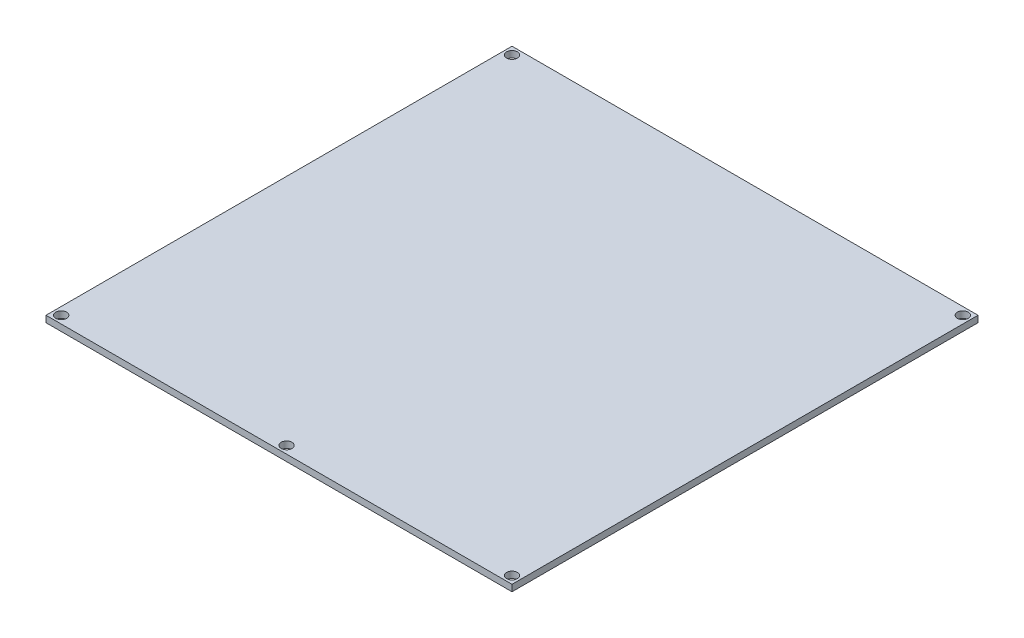
ISO-10303-21;
HEADER;
FILE_DESCRIPTION(('STEP AP214'),'2;1');
FILE_NAME('part.step','',(''),(''),'','','');
FILE_SCHEMA(('AUTOMOTIVE_DESIGN { 1 0 10303 214 1 1 1 1 }'));
ENDSEC;
DATA;
#1=APPLICATION_CONTEXT('core data for automotive mechanical design processes');
#2=APPLICATION_PROTOCOL_DEFINITION('international standard','automotive_design',2000,#1);
#3=PRODUCT_CONTEXT('',#1,'mechanical');
#4=PRODUCT('Part','Part','',(#3));
#5=PRODUCT_RELATED_PRODUCT_CATEGORY('part','',(#4));
#6=PRODUCT_DEFINITION_FORMATION('','',#4);
#7=PRODUCT_DEFINITION_CONTEXT('part definition',#1,'design');
#8=PRODUCT_DEFINITION('design','',#6,#7);
#9=PRODUCT_DEFINITION_SHAPE('','',#8);
#10=(LENGTH_UNIT() NAMED_UNIT(*) SI_UNIT(.MILLI.,.METRE.));
#11=(NAMED_UNIT(*) PLANE_ANGLE_UNIT() SI_UNIT($,.RADIAN.));
#12=(NAMED_UNIT(*) SI_UNIT($,.STERADIAN.) SOLID_ANGLE_UNIT());
#13=UNCERTAINTY_MEASURE_WITH_UNIT(LENGTH_MEASURE(1.E-05),#10,'distance_accuracy_value','');
#14=(GEOMETRIC_REPRESENTATION_CONTEXT(3) GLOBAL_UNCERTAINTY_ASSIGNED_CONTEXT((#13)) GLOBAL_UNIT_ASSIGNED_CONTEXT((#10,
#11,#12)) REPRESENTATION_CONTEXT('',''));
#15=CARTESIAN_POINT('',(0.,0.,0.));
#16=DIRECTION('',(0.,0.,1.));
#17=DIRECTION('',(1.,0.,0.));
#18=AXIS2_PLACEMENT_3D('',#15,#16,#17);
#19=CARTESIAN_POINT('',(0.,3.,0.));
#20=DIRECTION('',(0.,-1.,0.));
#21=DIRECTION('',(0.,0.,-1.));
#22=AXIS2_PLACEMENT_3D('',#19,#20,#21);
#23=PLANE('',#22);
#24=CARTESIAN_POINT('',(211.5,3.,-211.5));
#25=DIRECTION('',(0.,1.,0.));
#26=DIRECTION('',(0.,0.,1.));
#27=AXIS2_PLACEMENT_3D('',#24,#25,#26);
#28=CIRCLE('',#27,2.5);
#29=CARTESIAN_POINT('',(211.5,3.,-209.));
#30=VERTEX_POINT('',#29);
#31=EDGE_CURVE('E126',#30,#30,#28,.T.);
#32=ORIENTED_EDGE('',*,*,#31,.F.);
#33=EDGE_LOOP('',(#32));
#34=FACE_BOUND('',#33,.T.);
#35=CARTESIAN_POINT('',(3.5,3.,-3.5));
#36=DIRECTION('',(0.,1.,0.));
#37=DIRECTION('',(0.,0.,1.));
#38=AXIS2_PLACEMENT_3D('',#35,#36,#37);
#39=CIRCLE('',#38,2.5);
#40=CARTESIAN_POINT('',(3.5,3.,-1.));
#41=VERTEX_POINT('',#40);
#42=EDGE_CURVE('E114',#41,#41,#39,.T.);
#43=ORIENTED_EDGE('',*,*,#42,.F.);
#44=EDGE_LOOP('',(#43));
#45=FACE_BOUND('',#44,.T.);
#46=DIRECTION('',(0.,0.,1.));
#47=VECTOR('',#46,1.);
#48=CARTESIAN_POINT('',(0.,3.,0.));
#49=LINE('',#48,#47);
#50=CARTESIAN_POINT('',(0.,3.,-215.));
#51=VERTEX_POINT('',#50);
#52=CARTESIAN_POINT('',(0.,3.,0.));
#53=VERTEX_POINT('',#52);
#54=EDGE_CURVE('E84',#51,#53,#49,.T.);
#55=ORIENTED_EDGE('',*,*,#54,.T.);
#56=DIRECTION('',(1.,0.,0.));
#57=VECTOR('',#56,1.);
#58=CARTESIAN_POINT('',(0.,3.,0.));
#59=LINE('',#58,#57);
#60=CARTESIAN_POINT('',(215.,3.,0.));
#61=VERTEX_POINT('',#60);
#62=EDGE_CURVE('E79',#53,#61,#59,.T.);
#63=ORIENTED_EDGE('',*,*,#62,.T.);
#64=DIRECTION('',(0.,0.,-1.));
#65=VECTOR('',#64,1.);
#66=CARTESIAN_POINT('',(215.,3.,0.));
#67=LINE('',#66,#65);
#68=CARTESIAN_POINT('',(215.,3.,-215.));
#69=VERTEX_POINT('',#68);
#70=EDGE_CURVE('E82',#61,#69,#67,.T.);
#71=ORIENTED_EDGE('',*,*,#70,.T.);
#72=DIRECTION('',(-1.,0.,0.));
#73=VECTOR('',#72,1.);
#74=CARTESIAN_POINT('',(0.,3.,-215.));
#75=LINE('',#74,#73);
#76=EDGE_CURVE('E49',#69,#51,#75,.T.);
#77=ORIENTED_EDGE('',*,*,#76,.T.);
#78=EDGE_LOOP('',(#55,#63,#71,#77));
#79=FACE_BOUND('',#78,.T.);
#80=CARTESIAN_POINT('',(3.5,3.,-211.5));
#81=DIRECTION('',(0.,1.,0.));
#82=DIRECTION('',(0.,0.,1.));
#83=AXIS2_PLACEMENT_3D('',#80,#81,#82);
#84=CIRCLE('',#83,2.5);
#85=CARTESIAN_POINT('',(3.5,3.,-209.));
#86=VERTEX_POINT('',#85);
#87=EDGE_CURVE('E99',#86,#86,#84,.T.);
#88=ORIENTED_EDGE('',*,*,#87,.F.);
#89=EDGE_LOOP('',(#88));
#90=FACE_BOUND('',#89,.T.);
#91=CARTESIAN_POINT('',(211.5,3.,-3.5));
#92=DIRECTION('',(0.,1.,0.));
#93=DIRECTION('',(0.,0.,1.));
#94=AXIS2_PLACEMENT_3D('',#91,#92,#93);
#95=CIRCLE('',#94,2.5);
#96=CARTESIAN_POINT('',(211.5,3.,-1.));
#97=VERTEX_POINT('',#96);
#98=EDGE_CURVE('E120',#97,#97,#95,.T.);
#99=ORIENTED_EDGE('',*,*,#98,.F.);
#100=EDGE_LOOP('',(#99));
#101=FACE_BOUND('',#100,.T.);
#102=CARTESIAN_POINT('',(107.5,3.,-3.5));
#103=DIRECTION('',(0.,1.,0.));
#104=DIRECTION('',(0.,0.,1.));
#105=AXIS2_PLACEMENT_3D('',#102,#103,#104);
#106=CIRCLE('',#105,2.49999999999999);
#107=CARTESIAN_POINT('',(107.5,3.,-1.00000000000001));
#108=VERTEX_POINT('',#107);
#109=EDGE_CURVE('E132',#108,#108,#106,.T.);
#110=ORIENTED_EDGE('',*,*,#109,.F.);
#111=EDGE_LOOP('',(#110));
#112=FACE_BOUND('',#111,.T.);
#113=ADVANCED_FACE('F32',(#34,#45,#79,#90,#101,#112),#23,.F.);
#114=CARTESIAN_POINT('',(0.,0.,0.));
#115=DIRECTION('',(0.,-1.,0.));
#116=DIRECTION('',(0.,0.,-1.));
#117=AXIS2_PLACEMENT_3D('',#114,#115,#116);
#118=PLANE('',#117);
#119=CARTESIAN_POINT('',(211.5,0.,-211.5));
#120=DIRECTION('',(0.,1.,0.));
#121=DIRECTION('',(0.,0.,1.));
#122=AXIS2_PLACEMENT_3D('',#119,#120,#121);
#123=CIRCLE('',#122,2.5);
#124=CARTESIAN_POINT('',(211.5,0.,-209.));
#125=VERTEX_POINT('',#124);
#126=EDGE_CURVE('E129',#125,#125,#123,.T.);
#127=ORIENTED_EDGE('',*,*,#126,.T.);
#128=EDGE_LOOP('',(#127));
#129=FACE_BOUND('',#128,.T.);
#130=CARTESIAN_POINT('',(3.5,0.,-3.5));
#131=DIRECTION('',(0.,1.,0.));
#132=DIRECTION('',(0.,0.,1.));
#133=AXIS2_PLACEMENT_3D('',#130,#131,#132);
#134=CIRCLE('',#133,2.5);
#135=CARTESIAN_POINT('',(3.5,0.,-1.));
#136=VERTEX_POINT('',#135);
#137=EDGE_CURVE('E117',#136,#136,#134,.T.);
#138=ORIENTED_EDGE('',*,*,#137,.T.);
#139=EDGE_LOOP('',(#138));
#140=FACE_BOUND('',#139,.T.);
#141=DIRECTION('',(0.,0.,1.));
#142=VECTOR('',#141,1.);
#143=CARTESIAN_POINT('',(0.,0.,0.));
#144=LINE('',#143,#142);
#145=CARTESIAN_POINT('',(0.,0.,-215.));
#146=VERTEX_POINT('',#145);
#147=CARTESIAN_POINT('',(0.,0.,0.));
#148=VERTEX_POINT('',#147);
#149=EDGE_CURVE('E96',#146,#148,#144,.T.);
#150=ORIENTED_EDGE('',*,*,#149,.F.);
#151=DIRECTION('',(-1.,0.,0.));
#152=VECTOR('',#151,1.);
#153=CARTESIAN_POINT('',(0.,0.,-215.));
#154=LINE('',#153,#152);
#155=CARTESIAN_POINT('',(215.,0.,-215.));
#156=VERTEX_POINT('',#155);
#157=EDGE_CURVE('E72',#156,#146,#154,.T.);
#158=ORIENTED_EDGE('',*,*,#157,.F.);
#159=DIRECTION('',(0.,0.,-1.));
#160=VECTOR('',#159,1.);
#161=CARTESIAN_POINT('',(215.,0.,0.));
#162=LINE('',#161,#160);
#163=CARTESIAN_POINT('',(215.,0.,0.));
#164=VERTEX_POINT('',#163);
#165=EDGE_CURVE('E66',#164,#156,#162,.T.);
#166=ORIENTED_EDGE('',*,*,#165,.F.);
#167=DIRECTION('',(1.,0.,0.));
#168=VECTOR('',#167,1.);
#169=CARTESIAN_POINT('',(0.,0.,0.));
#170=LINE('',#169,#168);
#171=EDGE_CURVE('E88',#148,#164,#170,.T.);
#172=ORIENTED_EDGE('',*,*,#171,.F.);
#173=EDGE_LOOP('',(#150,#158,#166,#172));
#174=FACE_BOUND('',#173,.T.);
#175=CARTESIAN_POINT('',(3.5,0.,-211.5));
#176=DIRECTION('',(0.,1.,0.));
#177=DIRECTION('',(0.,0.,1.));
#178=AXIS2_PLACEMENT_3D('',#175,#176,#177);
#179=CIRCLE('',#178,2.5);
#180=CARTESIAN_POINT('',(3.5,0.,-209.));
#181=VERTEX_POINT('',#180);
#182=EDGE_CURVE('E111',#181,#181,#179,.T.);
#183=ORIENTED_EDGE('',*,*,#182,.T.);
#184=EDGE_LOOP('',(#183));
#185=FACE_BOUND('',#184,.T.);
#186=CARTESIAN_POINT('',(211.5,0.,-3.5));
#187=DIRECTION('',(0.,1.,0.));
#188=DIRECTION('',(0.,0.,1.));
#189=AXIS2_PLACEMENT_3D('',#186,#187,#188);
#190=CIRCLE('',#189,2.5);
#191=CARTESIAN_POINT('',(211.5,0.,-1.));
#192=VERTEX_POINT('',#191);
#193=EDGE_CURVE('E123',#192,#192,#190,.T.);
#194=ORIENTED_EDGE('',*,*,#193,.T.);
#195=EDGE_LOOP('',(#194));
#196=FACE_BOUND('',#195,.T.);
#197=CARTESIAN_POINT('',(107.5,0.,-3.5));
#198=DIRECTION('',(0.,1.,0.));
#199=DIRECTION('',(0.,0.,1.));
#200=AXIS2_PLACEMENT_3D('',#197,#198,#199);
#201=CIRCLE('',#200,2.49999999999999);
#202=CARTESIAN_POINT('',(107.5,0.,-1.00000000000001));
#203=VERTEX_POINT('',#202);
#204=EDGE_CURVE('E135',#203,#203,#201,.T.);
#205=ORIENTED_EDGE('',*,*,#204,.T.);
#206=EDGE_LOOP('',(#205));
#207=FACE_BOUND('',#206,.T.);
#208=ADVANCED_FACE('F107',(#129,#140,#174,#185,#196,#207),#118,.T.);
#209=CARTESIAN_POINT('',(0.,3.,0.));
#210=DIRECTION('',(1.,0.,0.));
#211=DIRECTION('',(0.,0.,-1.));
#212=AXIS2_PLACEMENT_3D('',#209,#210,#211);
#213=PLANE('',#212);
#214=ORIENTED_EDGE('',*,*,#149,.T.);
#215=DIRECTION('',(0.,-1.,0.));
#216=VECTOR('',#215,1.);
#217=CARTESIAN_POINT('',(0.,3.,0.));
#218=LINE('',#217,#216);
#219=EDGE_CURVE('E11',#53,#148,#218,.T.);
#220=ORIENTED_EDGE('',*,*,#219,.F.);
#221=ORIENTED_EDGE('',*,*,#54,.F.);
#222=DIRECTION('',(0.,-1.,0.));
#223=VECTOR('',#222,1.);
#224=CARTESIAN_POINT('',(0.,3.,-215.));
#225=LINE('',#224,#223);
#226=EDGE_CURVE('E92',#51,#146,#225,.T.);
#227=ORIENTED_EDGE('',*,*,#226,.T.);
#228=EDGE_LOOP('',(#214,#220,#221,#227));
#229=FACE_BOUND('',#228,.T.);
#230=ADVANCED_FACE('F34',(#229),#213,.F.);
#231=CARTESIAN_POINT('',(0.,3.,0.));
#232=DIRECTION('',(0.,0.,-1.));
#233=DIRECTION('',(-1.,0.,0.));
#234=AXIS2_PLACEMENT_3D('',#231,#232,#233);
#235=PLANE('',#234);
#236=ORIENTED_EDGE('',*,*,#171,.T.);
#237=DIRECTION('',(0.,-1.,0.));
#238=VECTOR('',#237,1.);
#239=CARTESIAN_POINT('',(215.,3.,0.));
#240=LINE('',#239,#238);
#241=EDGE_CURVE('E41',#61,#164,#240,.T.);
#242=ORIENTED_EDGE('',*,*,#241,.F.);
#243=ORIENTED_EDGE('',*,*,#62,.F.);
#244=ORIENTED_EDGE('',*,*,#219,.T.);
#245=EDGE_LOOP('',(#236,#242,#243,#244));
#246=FACE_BOUND('',#245,.T.);
#247=ADVANCED_FACE('F87',(#246),#235,.F.);
#248=CARTESIAN_POINT('',(215.,3.,0.));
#249=DIRECTION('',(-1.,0.,0.));
#250=DIRECTION('',(0.,0.,1.));
#251=AXIS2_PLACEMENT_3D('',#248,#249,#250);
#252=PLANE('',#251);
#253=ORIENTED_EDGE('',*,*,#165,.T.);
#254=DIRECTION('',(0.,-1.,0.));
#255=VECTOR('',#254,1.);
#256=CARTESIAN_POINT('',(215.,3.,-215.));
#257=LINE('',#256,#255);
#258=EDGE_CURVE('E89',#69,#156,#257,.T.);
#259=ORIENTED_EDGE('',*,*,#258,.F.);
#260=ORIENTED_EDGE('',*,*,#70,.F.);
#261=ORIENTED_EDGE('',*,*,#241,.T.);
#262=EDGE_LOOP('',(#253,#259,#260,#261));
#263=FACE_BOUND('',#262,.T.);
#264=ADVANCED_FACE('F90',(#263),#252,.F.);
#265=CARTESIAN_POINT('',(0.,3.,-215.));
#266=DIRECTION('',(0.,0.,1.));
#267=DIRECTION('',(1.,0.,0.));
#268=AXIS2_PLACEMENT_3D('',#265,#266,#267);
#269=PLANE('',#268);
#270=ORIENTED_EDGE('',*,*,#157,.T.);
#271=ORIENTED_EDGE('',*,*,#226,.F.);
#272=ORIENTED_EDGE('',*,*,#76,.F.);
#273=ORIENTED_EDGE('',*,*,#258,.T.);
#274=EDGE_LOOP('',(#270,#271,#272,#273));
#275=FACE_BOUND('',#274,.T.);
#276=ADVANCED_FACE('F104',(#275),#269,.F.);
#277=CARTESIAN_POINT('',(3.5,3.,-211.5));
#278=DIRECTION('',(0.,-1.,0.));
#279=DIRECTION('',(0.,0.,-1.));
#280=AXIS2_PLACEMENT_3D('',#277,#278,#279);
#281=CYLINDRICAL_SURFACE('',#280,2.5);
#282=ORIENTED_EDGE('',*,*,#87,.T.);
#283=EDGE_LOOP('',(#282));
#284=FACE_BOUND('',#283,.T.);
#285=ORIENTED_EDGE('',*,*,#182,.F.);
#286=EDGE_LOOP('',(#285));
#287=FACE_BOUND('',#286,.T.);
#288=ADVANCED_FACE('F155',(#284,#287),#281,.F.);
#289=CARTESIAN_POINT('',(3.5,3.,-3.5));
#290=DIRECTION('',(0.,-1.,0.));
#291=DIRECTION('',(0.,0.,-1.));
#292=AXIS2_PLACEMENT_3D('',#289,#290,#291);
#293=CYLINDRICAL_SURFACE('',#292,2.5);
#294=ORIENTED_EDGE('',*,*,#42,.T.);
#295=EDGE_LOOP('',(#294));
#296=FACE_BOUND('',#295,.T.);
#297=ORIENTED_EDGE('',*,*,#137,.F.);
#298=EDGE_LOOP('',(#297));
#299=FACE_BOUND('',#298,.T.);
#300=ADVANCED_FACE('F201',(#296,#299),#293,.F.);
#301=CARTESIAN_POINT('',(211.5,3.,-3.5));
#302=DIRECTION('',(0.,-1.,0.));
#303=DIRECTION('',(0.,0.,-1.));
#304=AXIS2_PLACEMENT_3D('',#301,#302,#303);
#305=CYLINDRICAL_SURFACE('',#304,2.5);
#306=ORIENTED_EDGE('',*,*,#98,.T.);
#307=EDGE_LOOP('',(#306));
#308=FACE_BOUND('',#307,.T.);
#309=ORIENTED_EDGE('',*,*,#193,.F.);
#310=EDGE_LOOP('',(#309));
#311=FACE_BOUND('',#310,.T.);
#312=ADVANCED_FACE('F209',(#308,#311),#305,.F.);
#313=CARTESIAN_POINT('',(211.5,3.,-211.5));
#314=DIRECTION('',(0.,-1.,0.));
#315=DIRECTION('',(0.,0.,-1.));
#316=AXIS2_PLACEMENT_3D('',#313,#314,#315);
#317=CYLINDRICAL_SURFACE('',#316,2.5);
#318=ORIENTED_EDGE('',*,*,#31,.T.);
#319=EDGE_LOOP('',(#318));
#320=FACE_BOUND('',#319,.T.);
#321=ORIENTED_EDGE('',*,*,#126,.F.);
#322=EDGE_LOOP('',(#321));
#323=FACE_BOUND('',#322,.T.);
#324=ADVANCED_FACE('F217',(#320,#323),#317,.F.);
#325=CARTESIAN_POINT('',(107.5,3.,-3.5));
#326=DIRECTION('',(0.,-1.,0.));
#327=DIRECTION('',(0.,0.,-1.));
#328=AXIS2_PLACEMENT_3D('',#325,#326,#327);
#329=CYLINDRICAL_SURFACE('',#328,2.49999999999999);
#330=ORIENTED_EDGE('',*,*,#109,.T.);
#331=EDGE_LOOP('',(#330));
#332=FACE_BOUND('',#331,.T.);
#333=ORIENTED_EDGE('',*,*,#204,.F.);
#334=EDGE_LOOP('',(#333));
#335=FACE_BOUND('',#334,.T.);
#336=ADVANCED_FACE('F141',(#332,#335),#329,.F.);
#337=CLOSED_SHELL('',(#113,#208,#230,#247,#264,#276,#288,#300,#312,#324,#336));
#338=MANIFOLD_SOLID_BREP('B2',#337);
#339=ADVANCED_BREP_SHAPE_REPRESENTATION('',(#18,#338),#14);
#340=SHAPE_DEFINITION_REPRESENTATION(#9,#339);
ENDSEC;
END-ISO-10303-21;
